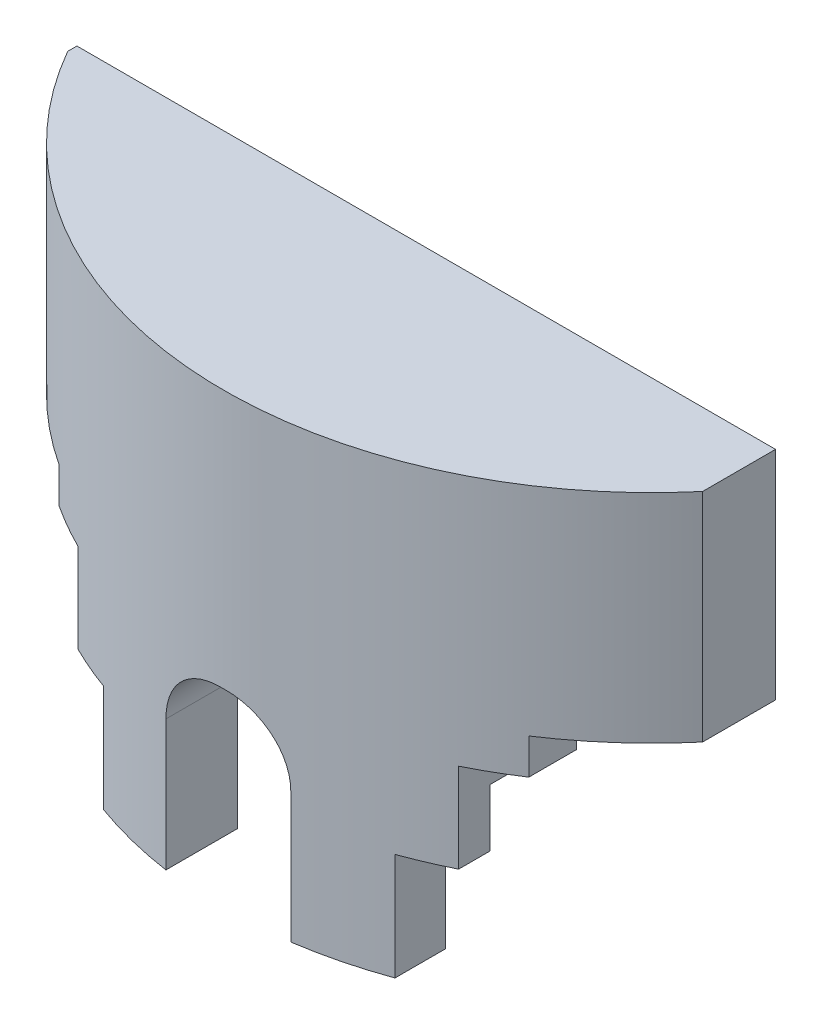
ISO-10303-21;
HEADER;
FILE_DESCRIPTION(('STEP AP214'),'2;1');
FILE_NAME('part.step','',(''),(''),'','','');
FILE_SCHEMA(('AUTOMOTIVE_DESIGN { 1 0 10303 214 1 1 1 1 }'));
ENDSEC;
DATA;
#1=APPLICATION_CONTEXT('core data for automotive mechanical design processes');
#2=APPLICATION_PROTOCOL_DEFINITION('international standard','automotive_design',2000,#1);
#3=PRODUCT_CONTEXT('',#1,'mechanical');
#4=PRODUCT('Part','Part','',(#3));
#5=PRODUCT_RELATED_PRODUCT_CATEGORY('part','',(#4));
#6=PRODUCT_DEFINITION_FORMATION('','',#4);
#7=PRODUCT_DEFINITION_CONTEXT('part definition',#1,'design');
#8=PRODUCT_DEFINITION('design','',#6,#7);
#9=PRODUCT_DEFINITION_SHAPE('','',#8);
#10=(LENGTH_UNIT() NAMED_UNIT(*) SI_UNIT(.MILLI.,.METRE.));
#11=(NAMED_UNIT(*) PLANE_ANGLE_UNIT() SI_UNIT($,.RADIAN.));
#12=(NAMED_UNIT(*) SI_UNIT($,.STERADIAN.) SOLID_ANGLE_UNIT());
#13=UNCERTAINTY_MEASURE_WITH_UNIT(LENGTH_MEASURE(1.E-05),#10,'distance_accuracy_value','');
#14=(GEOMETRIC_REPRESENTATION_CONTEXT(3) GLOBAL_UNCERTAINTY_ASSIGNED_CONTEXT((#13)) GLOBAL_UNIT_ASSIGNED_CONTEXT((#10,
#11,#12)) REPRESENTATION_CONTEXT('',''));
#15=CARTESIAN_POINT('',(0.,0.,0.));
#16=DIRECTION('',(0.,0.,1.));
#17=DIRECTION('',(1.,0.,0.));
#18=AXIS2_PLACEMENT_3D('',#15,#16,#17);
#19=CARTESIAN_POINT('',(0.,-42.5,0.));
#20=DIRECTION('',(0.,-1.,0.));
#21=DIRECTION('',(0.,0.,-1.));
#22=AXIS2_PLACEMENT_3D('',#19,#20,#21);
#23=PLANE('',#22);
#24=DIRECTION('',(0.,0.,1.));
#25=VECTOR('',#24,1.);
#26=CARTESIAN_POINT('',(32.,-42.5,34.2));
#27=LINE('',#26,#25);
#28=CARTESIAN_POINT('',(32.,-42.5,52.2));
#29=VERTEX_POINT('',#28);
#30=CARTESIAN_POINT('',(32.,-42.5,64.4980619863884));
#31=VERTEX_POINT('',#30);
#32=EDGE_CURVE('E381',#29,#31,#27,.T.);
#33=ORIENTED_EDGE('',*,*,#32,.F.);
#34=DIRECTION('',(1.,0.,0.));
#35=VECTOR('',#34,1.);
#36=CARTESIAN_POINT('',(0.,-42.5,52.2));
#37=LINE('',#36,#35);
#38=CARTESIAN_POINT('',(39.5,-42.5,52.2));
#39=VERTEX_POINT('',#38);
#40=EDGE_CURVE('E479',#29,#39,#37,.T.);
#41=ORIENTED_EDGE('',*,*,#40,.T.);
#42=DIRECTION('',(0.,0.,1.));
#43=VECTOR('',#42,1.);
#44=CARTESIAN_POINT('',(39.5,-42.5,0.));
#45=LINE('',#44,#43);
#46=CARTESIAN_POINT('',(39.5,-42.5,60.1975913139388));
#47=VERTEX_POINT('',#46);
#48=EDGE_CURVE('E370',#39,#47,#45,.T.);
#49=ORIENTED_EDGE('',*,*,#48,.T.);
#50=CARTESIAN_POINT('',(0.,-42.5,0.));
#51=DIRECTION('',(0.,-1.,0.));
#52=DIRECTION('',(0.,0.,-1.));
#53=AXIS2_PLACEMENT_3D('',#50,#51,#52);
#54=CIRCLE('',#53,72.);
#55=EDGE_CURVE('E359',#47,#31,#54,.T.);
#56=ORIENTED_EDGE('',*,*,#55,.T.);
#57=EDGE_LOOP('',(#33,#41,#49,#56));
#58=FACE_BOUND('',#57,.T.);
#59=ADVANCED_FACE('F36',(#58),#23,.T.);
#60=CARTESIAN_POINT('',(39.5,-42.5,0.));
#61=DIRECTION('',(-1.,0.,0.));
#62=DIRECTION('',(0.,0.,1.));
#63=AXIS2_PLACEMENT_3D('',#60,#61,#62);
#64=PLANE('',#63);
#65=ORIENTED_EDGE('',*,*,#48,.F.);
#66=DIRECTION('',(0.,-1.,0.));
#67=VECTOR('',#66,1.);
#68=CARTESIAN_POINT('',(39.5,-42.5,52.2));
#69=LINE('',#68,#67);
#70=CARTESIAN_POINT('',(39.5,-36.5,52.2));
#71=VERTEX_POINT('',#70);
#72=EDGE_CURVE('E450',#71,#39,#69,.T.);
#73=ORIENTED_EDGE('',*,*,#72,.F.);
#74=DIRECTION('',(0.,0.,1.));
#75=VECTOR('',#74,1.);
#76=CARTESIAN_POINT('',(39.5,-36.5,0.));
#77=LINE('',#76,#75);
#78=CARTESIAN_POINT('',(39.5,-36.5,60.1975913139388));
#79=VERTEX_POINT('',#78);
#80=EDGE_CURVE('E365',#71,#79,#77,.T.);
#81=ORIENTED_EDGE('',*,*,#80,.T.);
#82=DIRECTION('',(0.,1.,0.));
#83=VECTOR('',#82,1.);
#84=CARTESIAN_POINT('',(39.5,-42.5,60.1975913139388));
#85=LINE('',#84,#83);
#86=EDGE_CURVE('E250',#47,#79,#85,.T.);
#87=ORIENTED_EDGE('',*,*,#86,.F.);
#88=EDGE_LOOP('',(#65,#73,#81,#87));
#89=FACE_BOUND('',#88,.T.);
#90=ADVANCED_FACE('F324',(#89),#64,.F.);
#91=CARTESIAN_POINT('',(-39.5,-42.5,0.));
#92=DIRECTION('',(1.,0.,0.));
#93=DIRECTION('',(0.,0.,-1.));
#94=AXIS2_PLACEMENT_3D('',#91,#92,#93);
#95=PLANE('',#94);
#96=DIRECTION('',(0.,1.,0.));
#97=VECTOR('',#96,1.);
#98=CARTESIAN_POINT('',(-39.5,-42.5,52.2));
#99=LINE('',#98,#97);
#100=CARTESIAN_POINT('',(-39.5,-42.5,52.2));
#101=VERTEX_POINT('',#100);
#102=CARTESIAN_POINT('',(-39.5,-36.5,52.2));
#103=VERTEX_POINT('',#102);
#104=EDGE_CURVE('E454',#101,#103,#99,.T.);
#105=ORIENTED_EDGE('',*,*,#104,.F.);
#106=DIRECTION('',(0.,0.,-1.));
#107=VECTOR('',#106,1.);
#108=CARTESIAN_POINT('',(-39.5,-42.5,0.));
#109=LINE('',#108,#107);
#110=CARTESIAN_POINT('',(-39.5,-42.5,60.1975913139388));
#111=VERTEX_POINT('',#110);
#112=EDGE_CURVE('E350',#111,#101,#109,.T.);
#113=ORIENTED_EDGE('',*,*,#112,.F.);
#114=DIRECTION('',(0.,1.,0.));
#115=VECTOR('',#114,1.);
#116=CARTESIAN_POINT('',(-39.5,-42.5,60.1975913139388));
#117=LINE('',#116,#115);
#118=CARTESIAN_POINT('',(-39.5,-36.5,60.1975913139388));
#119=VERTEX_POINT('',#118);
#120=EDGE_CURVE('E358',#111,#119,#117,.T.);
#121=ORIENTED_EDGE('',*,*,#120,.T.);
#122=DIRECTION('',(0.,0.,-1.));
#123=VECTOR('',#122,1.);
#124=CARTESIAN_POINT('',(-39.5,-36.5,0.));
#125=LINE('',#124,#123);
#126=EDGE_CURVE('E367',#119,#103,#125,.T.);
#127=ORIENTED_EDGE('',*,*,#126,.T.);
#128=EDGE_LOOP('',(#105,#113,#121,#127));
#129=FACE_BOUND('',#128,.T.);
#130=ADVANCED_FACE('F331',(#129),#95,.F.);
#131=ORIENTED_EDGE('',*,*,#112,.T.);
#132=DIRECTION('',(1.,0.,0.));
#133=VECTOR('',#132,1.);
#134=CARTESIAN_POINT('',(0.,-42.5,52.2));
#135=LINE('',#134,#133);
#136=CARTESIAN_POINT('',(-32.,-42.5,52.2));
#137=VERTEX_POINT('',#136);
#138=EDGE_CURVE('E352',#101,#137,#135,.T.);
#139=ORIENTED_EDGE('',*,*,#138,.T.);
#140=DIRECTION('',(0.,0.,-1.));
#141=VECTOR('',#140,1.);
#142=CARTESIAN_POINT('',(-32.,-42.5,64.4980619863884));
#143=LINE('',#142,#141);
#144=CARTESIAN_POINT('',(-32.,-42.5,64.4980619863884));
#145=VERTEX_POINT('',#144);
#146=EDGE_CURVE('E384',#145,#137,#143,.T.);
#147=ORIENTED_EDGE('',*,*,#146,.F.);
#148=EDGE_CURVE('E355',#145,#111,#54,.T.);
#149=ORIENTED_EDGE('',*,*,#148,.T.);
#150=EDGE_LOOP('',(#131,#139,#147,#149));
#151=FACE_BOUND('',#150,.T.);
#152=ADVANCED_FACE('F327',(#151),#23,.T.);
#153=CARTESIAN_POINT('',(-32.,-57.5,64.4980619863884));
#154=DIRECTION('',(1.,0.,0.));
#155=DIRECTION('',(0.,0.,-1.));
#156=AXIS2_PLACEMENT_3D('',#153,#154,#155);
#157=PLANE('',#156);
#158=DIRECTION('',(0.,1.,0.));
#159=VECTOR('',#158,1.);
#160=CARTESIAN_POINT('',(-32.,-57.5,52.2));
#161=LINE('',#160,#159);
#162=CARTESIAN_POINT('',(-32.,-47.8210916541997,52.2));
#163=VERTEX_POINT('',#162);
#164=EDGE_CURVE('E482',#163,#137,#161,.T.);
#165=ORIENTED_EDGE('',*,*,#164,.F.);
#166=DIRECTION('',(0.,0.,-1.));
#167=VECTOR('',#166,1.);
#168=CARTESIAN_POINT('',(-32.,-47.8210916541997,59.2));
#169=LINE('',#168,#167);
#170=CARTESIAN_POINT('',(-32.,-47.8210916541997,59.2));
#171=VERTEX_POINT('',#170);
#172=EDGE_CURVE('E406',#163,#171,#169,.F.);
#173=ORIENTED_EDGE('',*,*,#172,.T.);
#174=DIRECTION('',(0.,1.,0.));
#175=VECTOR('',#174,1.);
#176=CARTESIAN_POINT('',(-32.,-57.5,59.2));
#177=LINE('',#176,#175);
#178=CARTESIAN_POINT('',(-32.,-57.5,59.2));
#179=VERTEX_POINT('',#178);
#180=EDGE_CURVE('E415',#179,#171,#177,.T.);
#181=ORIENTED_EDGE('',*,*,#180,.F.);
#182=DIRECTION('',(0.,0.,-1.));
#183=VECTOR('',#182,1.);
#184=CARTESIAN_POINT('',(-32.,-57.5,64.4980619863884));
#185=LINE('',#184,#183);
#186=CARTESIAN_POINT('',(-32.,-57.5,64.4980619863884));
#187=VERTEX_POINT('',#186);
#188=EDGE_CURVE('E388',#187,#179,#185,.T.);
#189=ORIENTED_EDGE('',*,*,#188,.F.);
#190=DIRECTION('',(0.,1.,0.));
#191=VECTOR('',#190,1.);
#192=CARTESIAN_POINT('',(-32.,-57.5,64.4980619863884));
#193=LINE('',#192,#191);
#194=EDGE_CURVE('E368',#187,#145,#193,.T.);
#195=ORIENTED_EDGE('',*,*,#194,.T.);
#196=ORIENTED_EDGE('',*,*,#146,.T.);
#197=EDGE_LOOP('',(#165,#173,#181,#189,#195,#196));
#198=FACE_BOUND('',#197,.T.);
#199=ADVANCED_FACE('F338',(#198),#157,.F.);
#200=CARTESIAN_POINT('',(32.,-57.5,34.2));
#201=DIRECTION('',(-1.,0.,0.));
#202=DIRECTION('',(0.,0.,1.));
#203=AXIS2_PLACEMENT_3D('',#200,#201,#202);
#204=PLANE('',#203);
#205=DIRECTION('',(0.,-1.,0.));
#206=VECTOR('',#205,1.);
#207=CARTESIAN_POINT('',(32.,-57.5,52.2));
#208=LINE('',#207,#206);
#209=CARTESIAN_POINT('',(32.,-47.8210916541997,52.2));
#210=VERTEX_POINT('',#209);
#211=EDGE_CURVE('E470',#29,#210,#208,.T.);
#212=ORIENTED_EDGE('',*,*,#211,.F.);
#213=ORIENTED_EDGE('',*,*,#32,.T.);
#214=DIRECTION('',(0.,1.,0.));
#215=VECTOR('',#214,1.);
#216=CARTESIAN_POINT('',(32.,-57.5,64.4980619863884));
#217=LINE('',#216,#215);
#218=CARTESIAN_POINT('',(32.,-57.5,64.4980619863884));
#219=VERTEX_POINT('',#218);
#220=EDGE_CURVE('E377',#219,#31,#217,.T.);
#221=ORIENTED_EDGE('',*,*,#220,.F.);
#222=DIRECTION('',(0.,0.,1.));
#223=VECTOR('',#222,1.);
#224=CARTESIAN_POINT('',(32.,-57.5,34.2));
#225=LINE('',#224,#223);
#226=CARTESIAN_POINT('',(32.,-57.5,59.2));
#227=VERTEX_POINT('',#226);
#228=EDGE_CURVE('E380',#227,#219,#225,.T.);
#229=ORIENTED_EDGE('',*,*,#228,.F.);
#230=DIRECTION('',(0.,-1.,0.));
#231=VECTOR('',#230,1.);
#232=CARTESIAN_POINT('',(32.,-57.5,59.2));
#233=LINE('',#232,#231);
#234=CARTESIAN_POINT('',(32.,-47.8210916541997,59.2));
#235=VERTEX_POINT('',#234);
#236=EDGE_CURVE('E421',#235,#227,#233,.T.);
#237=ORIENTED_EDGE('',*,*,#236,.F.);
#238=DIRECTION('',(0.,0.,-1.));
#239=VECTOR('',#238,1.);
#240=CARTESIAN_POINT('',(32.,-47.8210916541997,59.2));
#241=LINE('',#240,#239);
#242=EDGE_CURVE('E270',#235,#210,#241,.T.);
#243=ORIENTED_EDGE('',*,*,#242,.T.);
#244=EDGE_LOOP('',(#212,#213,#221,#229,#237,#243));
#245=FACE_BOUND('',#244,.T.);
#246=ADVANCED_FACE('F344',(#245),#204,.F.);
#247=CARTESIAN_POINT('',(0.,-53.5,59.2));
#248=DIRECTION('',(0.,0.,-1.));
#249=DIRECTION('',(-1.,0.,0.));
#250=AXIS2_PLACEMENT_3D('',#247,#248,#249);
#251=CYLINDRICAL_SURFACE('',#250,32.5);
#252=CARTESIAN_POINT('',(0.,-53.5,52.2));
#253=DIRECTION('',(0.,0.,-1.));
#254=DIRECTION('',(-1.,0.,0.));
#255=AXIS2_PLACEMENT_3D('',#252,#253,#254);
#256=CIRCLE('',#255,32.5);
#257=EDGE_CURVE('E45',#210,#163,#256,.F.);
#258=ORIENTED_EDGE('',*,*,#257,.F.);
#259=ORIENTED_EDGE('',*,*,#242,.F.);
#260=CARTESIAN_POINT('',(0.,-53.5,59.2));
#261=DIRECTION('',(0.,0.,-1.));
#262=DIRECTION('',(-1.,0.,0.));
#263=AXIS2_PLACEMENT_3D('',#260,#261,#262);
#264=CIRCLE('',#263,32.5);
#265=EDGE_CURVE('E430',#171,#235,#264,.T.);
#266=ORIENTED_EDGE('',*,*,#265,.F.);
#267=ORIENTED_EDGE('',*,*,#172,.F.);
#268=EDGE_LOOP('',(#258,#259,#266,#267));
#269=FACE_BOUND('',#268,.T.);
#270=ADVANCED_FACE('F491',(#269),#251,.F.);
#271=CARTESIAN_POINT('',(0.,-75.5,0.));
#272=DIRECTION('',(0.,1.,0.));
#273=DIRECTION('',(0.,0.,1.));
#274=AXIS2_PLACEMENT_3D('',#271,#272,#273);
#275=PLANE('',#274);
#276=DIRECTION('',(-1.,0.,0.));
#277=VECTOR('',#276,1.);
#278=CARTESIAN_POINT('',(0.,-75.5,59.2));
#279=LINE('',#278,#277);
#280=CARTESIAN_POINT('',(-10.5,-75.5,59.2));
#281=VERTEX_POINT('',#280);
#282=CARTESIAN_POINT('',(-24.5,-75.5,59.2));
#283=VERTEX_POINT('',#282);
#284=EDGE_CURVE('E265',#281,#283,#279,.T.);
#285=ORIENTED_EDGE('',*,*,#284,.F.);
#286=DIRECTION('',(0.,0.,-1.));
#287=VECTOR('',#286,1.);
#288=CARTESIAN_POINT('',(-10.5,-75.5,34.2));
#289=LINE('',#288,#287);
#290=CARTESIAN_POINT('',(-10.5,-75.5,71.2302604235026));
#291=VERTEX_POINT('',#290);
#292=EDGE_CURVE('E442',#291,#281,#289,.T.);
#293=ORIENTED_EDGE('',*,*,#292,.F.);
#294=CARTESIAN_POINT('',(0.,-75.5,0.));
#295=DIRECTION('',(0.,-1.,0.));
#296=DIRECTION('',(0.,0.,1.));
#297=AXIS2_PLACEMENT_3D('',#294,#295,#296);
#298=CIRCLE('',#297,72.);
#299=CARTESIAN_POINT('',(-24.5,-75.5,67.7033972559723));
#300=VERTEX_POINT('',#299);
#301=EDGE_CURVE('E412',#291,#300,#298,.T.);
#302=ORIENTED_EDGE('',*,*,#301,.T.);
#303=DIRECTION('',(0.,0.,-1.));
#304=VECTOR('',#303,1.);
#305=CARTESIAN_POINT('',(-24.5,-75.5,34.2));
#306=LINE('',#305,#304);
#307=EDGE_CURVE('E399',#300,#283,#306,.T.);
#308=ORIENTED_EDGE('',*,*,#307,.T.);
#309=EDGE_LOOP('',(#285,#293,#302,#308));
#310=FACE_BOUND('',#309,.T.);
#311=ADVANCED_FACE('F540',(#310),#275,.F.);
#312=CARTESIAN_POINT('',(0.,-57.5,0.));
#313=DIRECTION('',(0.,-1.,0.));
#314=DIRECTION('',(0.,0.,-1.));
#315=AXIS2_PLACEMENT_3D('',#312,#313,#314);
#316=PLANE('',#315);
#317=ORIENTED_EDGE('',*,*,#188,.T.);
#318=DIRECTION('',(1.,0.,0.));
#319=VECTOR('',#318,1.);
#320=CARTESIAN_POINT('',(0.,-57.5,59.2));
#321=LINE('',#320,#319);
#322=CARTESIAN_POINT('',(-24.5,-57.5,59.2));
#323=VERTEX_POINT('',#322);
#324=EDGE_CURVE('E418',#179,#323,#321,.T.);
#325=ORIENTED_EDGE('',*,*,#324,.T.);
#326=DIRECTION('',(0.,0.,-1.));
#327=VECTOR('',#326,1.);
#328=CARTESIAN_POINT('',(-24.5,-57.5,34.2));
#329=LINE('',#328,#327);
#330=CARTESIAN_POINT('',(-24.5,-57.5,67.7033972559723));
#331=VERTEX_POINT('',#330);
#332=EDGE_CURVE('E400',#331,#323,#329,.T.);
#333=ORIENTED_EDGE('',*,*,#332,.F.);
#334=CARTESIAN_POINT('',(0.,-57.5,0.));
#335=DIRECTION('',(0.,-1.,0.));
#336=DIRECTION('',(0.,0.,-1.));
#337=AXIS2_PLACEMENT_3D('',#334,#335,#336);
#338=CIRCLE('',#337,72.);
#339=EDGE_CURVE('E383',#331,#187,#338,.T.);
#340=ORIENTED_EDGE('',*,*,#339,.T.);
#341=EDGE_LOOP('',(#317,#325,#333,#340));
#342=FACE_BOUND('',#341,.T.);
#343=ADVANCED_FACE('F549',(#342),#316,.T.);
#344=DIRECTION('',(0.,0.,1.));
#345=VECTOR('',#344,1.);
#346=CARTESIAN_POINT('',(24.5,-57.5,34.2));
#347=LINE('',#346,#345);
#348=CARTESIAN_POINT('',(24.5,-57.5,59.2));
#349=VERTEX_POINT('',#348);
#350=CARTESIAN_POINT('',(24.5,-57.5,67.7033972559723));
#351=VERTEX_POINT('',#350);
#352=EDGE_CURVE('E404',#349,#351,#347,.T.);
#353=ORIENTED_EDGE('',*,*,#352,.F.);
#354=DIRECTION('',(1.,0.,0.));
#355=VECTOR('',#354,1.);
#356=CARTESIAN_POINT('',(0.,-57.5,59.2));
#357=LINE('',#356,#355);
#358=EDGE_CURVE('E423',#349,#227,#357,.T.);
#359=ORIENTED_EDGE('',*,*,#358,.T.);
#360=ORIENTED_EDGE('',*,*,#228,.T.);
#361=EDGE_CURVE('E391',#219,#351,#338,.T.);
#362=ORIENTED_EDGE('',*,*,#361,.T.);
#363=EDGE_LOOP('',(#353,#359,#360,#362));
#364=FACE_BOUND('',#363,.T.);
#365=ADVANCED_FACE('F503',(#364),#316,.T.);
#366=CARTESIAN_POINT('',(24.5,-75.5,34.2));
#367=DIRECTION('',(-1.,0.,0.));
#368=DIRECTION('',(0.,0.,1.));
#369=AXIS2_PLACEMENT_3D('',#366,#367,#368);
#370=PLANE('',#369);
#371=DIRECTION('',(0.,-1.,0.));
#372=VECTOR('',#371,1.);
#373=CARTESIAN_POINT('',(24.5,-75.5,59.2));
#374=LINE('',#373,#372);
#375=CARTESIAN_POINT('',(24.5,-75.5,59.2));
#376=VERTEX_POINT('',#375);
#377=EDGE_CURVE('E426',#349,#376,#374,.T.);
#378=ORIENTED_EDGE('',*,*,#377,.F.);
#379=ORIENTED_EDGE('',*,*,#352,.T.);
#380=DIRECTION('',(0.,1.,0.));
#381=VECTOR('',#380,1.);
#382=CARTESIAN_POINT('',(24.5,-75.5,67.7033972559723));
#383=LINE('',#382,#381);
#384=CARTESIAN_POINT('',(24.5,-75.5,67.7033972559723));
#385=VERTEX_POINT('',#384);
#386=EDGE_CURVE('E386',#385,#351,#383,.T.);
#387=ORIENTED_EDGE('',*,*,#386,.F.);
#388=DIRECTION('',(0.,0.,1.));
#389=VECTOR('',#388,1.);
#390=CARTESIAN_POINT('',(24.5,-75.5,34.2));
#391=LINE('',#390,#389);
#392=EDGE_CURVE('E403',#376,#385,#391,.T.);
#393=ORIENTED_EDGE('',*,*,#392,.F.);
#394=EDGE_LOOP('',(#378,#379,#387,#393));
#395=FACE_BOUND('',#394,.T.);
#396=ADVANCED_FACE('F508',(#395),#370,.F.);
#397=CARTESIAN_POINT('',(-24.5,-75.5,34.2));
#398=DIRECTION('',(1.,0.,0.));
#399=DIRECTION('',(0.,0.,-1.));
#400=AXIS2_PLACEMENT_3D('',#397,#398,#399);
#401=PLANE('',#400);
#402=DIRECTION('',(0.,1.,0.));
#403=VECTOR('',#402,1.);
#404=CARTESIAN_POINT('',(-24.5,-75.5,59.2));
#405=LINE('',#404,#403);
#406=EDGE_CURVE('E428',#283,#323,#405,.T.);
#407=ORIENTED_EDGE('',*,*,#406,.F.);
#408=ORIENTED_EDGE('',*,*,#307,.F.);
#409=DIRECTION('',(0.,1.,0.));
#410=VECTOR('',#409,1.);
#411=CARTESIAN_POINT('',(-24.5,-75.5,67.7033972559723));
#412=LINE('',#411,#410);
#413=EDGE_CURVE('E396',#300,#331,#412,.T.);
#414=ORIENTED_EDGE('',*,*,#413,.T.);
#415=ORIENTED_EDGE('',*,*,#332,.T.);
#416=EDGE_LOOP('',(#407,#408,#414,#415));
#417=FACE_BOUND('',#416,.T.);
#418=ADVANCED_FACE('F543',(#417),#401,.F.);
#419=CARTESIAN_POINT('',(10.5,-75.5,71.2302604235026));
#420=VERTEX_POINT('',#419);
#421=EDGE_CURVE('E409',#385,#420,#298,.T.);
#422=ORIENTED_EDGE('',*,*,#421,.T.);
#423=DIRECTION('',(0.,0.,1.));
#424=VECTOR('',#423,1.);
#425=CARTESIAN_POINT('',(10.5,-75.5,34.2));
#426=LINE('',#425,#424);
#427=CARTESIAN_POINT('',(10.5,-75.5,59.2));
#428=VERTEX_POINT('',#427);
#429=EDGE_CURVE('E440',#428,#420,#426,.T.);
#430=ORIENTED_EDGE('',*,*,#429,.F.);
#431=EDGE_CURVE('E267',#376,#428,#279,.T.);
#432=ORIENTED_EDGE('',*,*,#431,.F.);
#433=ORIENTED_EDGE('',*,*,#392,.T.);
#434=EDGE_LOOP('',(#422,#430,#432,#433));
#435=FACE_BOUND('',#434,.T.);
#436=ADVANCED_FACE('F512',(#435),#275,.F.);
#437=CARTESIAN_POINT('',(0.,-36.5,0.));
#438=DIRECTION('',(0.,1.,0.));
#439=DIRECTION('',(0.,0.,1.));
#440=AXIS2_PLACEMENT_3D('',#437,#438,#439);
#441=PLANE('',#440);
#442=DIRECTION('',(-1.,0.,0.));
#443=VECTOR('',#442,1.);
#444=CARTESIAN_POINT('',(-62.5,-36.5,34.2));
#445=LINE('',#444,#443);
#446=CARTESIAN_POINT('',(-40.7749773139559,-36.5,34.2));
#447=VERTEX_POINT('',#446);
#448=CARTESIAN_POINT('',(-62.5,-36.5,34.2));
#449=VERTEX_POINT('',#448);
#450=EDGE_CURVE('E243',#447,#449,#445,.T.);
#451=ORIENTED_EDGE('',*,*,#450,.F.);
#452=DIRECTION('',(0.,0.,-1.));
#453=VECTOR('',#452,1.);
#454=CARTESIAN_POINT('',(-40.7749773139559,-36.5,52.2));
#455=LINE('',#454,#453);
#456=CARTESIAN_POINT('',(-40.7749773139559,-36.5,52.2));
#457=VERTEX_POINT('',#456);
#458=EDGE_CURVE('E445',#447,#457,#455,.F.);
#459=ORIENTED_EDGE('',*,*,#458,.T.);
#460=DIRECTION('',(-1.,0.,0.));
#461=VECTOR('',#460,1.);
#462=CARTESIAN_POINT('',(0.,-36.5,52.2));
#463=LINE('',#462,#461);
#464=EDGE_CURVE('E452',#103,#457,#463,.T.);
#465=ORIENTED_EDGE('',*,*,#464,.F.);
#466=ORIENTED_EDGE('',*,*,#126,.F.);
#467=CARTESIAN_POINT('',(0.,-36.5,0.));
#468=DIRECTION('',(0.,1.,0.));
#469=DIRECTION('',(0.,0.,1.));
#470=AXIS2_PLACEMENT_3D('',#467,#468,#469);
#471=CIRCLE('',#470,72.);
#472=CARTESIAN_POINT('',(-62.5,-36.5,35.7456291034303));
#473=VERTEX_POINT('',#472);
#474=EDGE_CURVE('E253',#473,#119,#471,.T.);
#475=ORIENTED_EDGE('',*,*,#474,.F.);
#476=DIRECTION('',(0.,0.,1.));
#477=VECTOR('',#476,1.);
#478=CARTESIAN_POINT('',(-62.5,-36.5,34.2));
#479=LINE('',#478,#477);
#480=EDGE_CURVE('E242',#449,#473,#479,.T.);
#481=ORIENTED_EDGE('',*,*,#480,.F.);
#482=EDGE_LOOP('',(#451,#459,#465,#466,#475,#481));
#483=FACE_BOUND('',#482,.T.);
#484=ADVANCED_FACE('F322',(#483),#441,.F.);
#485=CARTESIAN_POINT('',(55.,-36.5,34.2));
#486=VERTEX_POINT('',#485);
#487=CARTESIAN_POINT('',(40.7749773139559,-36.5,34.2));
#488=VERTEX_POINT('',#487);
#489=EDGE_CURVE('E233',#486,#488,#445,.T.);
#490=ORIENTED_EDGE('',*,*,#489,.F.);
#491=DIRECTION('',(0.,0.,-1.));
#492=VECTOR('',#491,1.);
#493=CARTESIAN_POINT('',(55.,-36.5,72.));
#494=LINE('',#493,#492);
#495=CARTESIAN_POINT('',(55.,-36.5,46.4650406219558));
#496=VERTEX_POINT('',#495);
#497=EDGE_CURVE('E220',#496,#486,#494,.T.);
#498=ORIENTED_EDGE('',*,*,#497,.F.);
#499=EDGE_CURVE('E246',#79,#496,#471,.T.);
#500=ORIENTED_EDGE('',*,*,#499,.F.);
#501=ORIENTED_EDGE('',*,*,#80,.F.);
#502=DIRECTION('',(-1.,0.,0.));
#503=VECTOR('',#502,1.);
#504=CARTESIAN_POINT('',(0.,-36.5,52.2));
#505=LINE('',#504,#503);
#506=CARTESIAN_POINT('',(40.7749773139559,-36.5,52.2));
#507=VERTEX_POINT('',#506);
#508=EDGE_CURVE('E448',#507,#71,#505,.T.);
#509=ORIENTED_EDGE('',*,*,#508,.F.);
#510=DIRECTION('',(0.,0.,-1.));
#511=VECTOR('',#510,1.);
#512=CARTESIAN_POINT('',(40.7749773139559,-36.5,52.2));
#513=LINE('',#512,#511);
#514=EDGE_CURVE('E241',#507,#488,#513,.T.);
#515=ORIENTED_EDGE('',*,*,#514,.T.);
#516=EDGE_LOOP('',(#490,#498,#500,#501,#509,#515));
#517=FACE_BOUND('',#516,.T.);
#518=ADVANCED_FACE('F239',(#517),#441,.F.);
#519=CARTESIAN_POINT('',(-62.5,-36.5,34.2));
#520=DIRECTION('',(0.,0.,-1.));
#521=DIRECTION('',(-1.,0.,0.));
#522=AXIS2_PLACEMENT_3D('',#519,#520,#521);
#523=PLANE('',#522);
#524=DIRECTION('',(0.,1.,0.));
#525=VECTOR('',#524,1.);
#526=CARTESIAN_POINT('',(55.,0.,34.2));
#527=LINE('',#526,#525);
#528=CARTESIAN_POINT('',(55.,0.,34.2));
#529=VERTEX_POINT('',#528);
#530=EDGE_CURVE('E51',#486,#529,#527,.T.);
#531=ORIENTED_EDGE('',*,*,#530,.F.);
#532=ORIENTED_EDGE('',*,*,#489,.T.);
#533=CARTESIAN_POINT('',(27.,-22.,34.2));
#534=DIRECTION('',(0.,0.,-1.));
#535=DIRECTION('',(-1.,0.,0.));
#536=AXIS2_PLACEMENT_3D('',#533,#534,#535);
#537=CIRCLE('',#536,20.);
#538=CARTESIAN_POINT('',(27.,-2.,34.2));
#539=VERTEX_POINT('',#538);
#540=EDGE_CURVE('E468',#539,#488,#537,.T.);
#541=ORIENTED_EDGE('',*,*,#540,.F.);
#542=DIRECTION('',(1.,0.,0.));
#543=VECTOR('',#542,1.);
#544=CARTESIAN_POINT('',(27.,-2.,34.2));
#545=LINE('',#544,#543);
#546=CARTESIAN_POINT('',(-27.,-2.,34.2));
#547=VERTEX_POINT('',#546);
#548=EDGE_CURVE('E462',#547,#539,#545,.T.);
#549=ORIENTED_EDGE('',*,*,#548,.F.);
#550=CARTESIAN_POINT('',(-27.,-22.,34.2));
#551=DIRECTION('',(0.,0.,-1.));
#552=DIRECTION('',(-1.,0.,0.));
#553=AXIS2_PLACEMENT_3D('',#550,#551,#552);
#554=CIRCLE('',#553,20.);
#555=EDGE_CURVE('E466',#447,#547,#554,.T.);
#556=ORIENTED_EDGE('',*,*,#555,.F.);
#557=ORIENTED_EDGE('',*,*,#450,.T.);
#558=DIRECTION('',(0.,1.,0.));
#559=VECTOR('',#558,1.);
#560=CARTESIAN_POINT('',(-62.5,-36.5,34.2));
#561=LINE('',#560,#559);
#562=CARTESIAN_POINT('',(-62.5,0.,34.2));
#563=VERTEX_POINT('',#562);
#564=EDGE_CURVE('E256',#449,#563,#561,.T.);
#565=ORIENTED_EDGE('',*,*,#564,.T.);
#566=DIRECTION('',(-1.,0.,0.));
#567=VECTOR('',#566,1.);
#568=CARTESIAN_POINT('',(-62.5,0.,34.2));
#569=LINE('',#568,#567);
#570=EDGE_CURVE('E236',#529,#563,#569,.T.);
#571=ORIENTED_EDGE('',*,*,#570,.F.);
#572=EDGE_LOOP('',(#531,#532,#541,#549,#556,#557,#565,#571));
#573=FACE_BOUND('',#572,.T.);
#574=ADVANCED_FACE('F231',(#573),#523,.T.);
#575=CARTESIAN_POINT('',(0.,-36.5,0.));
#576=DIRECTION('',(0.,1.,0.));
#577=DIRECTION('',(0.,0.,1.));
#578=AXIS2_PLACEMENT_3D('',#575,#576,#577);
#579=CYLINDRICAL_SURFACE('',#578,72.);
#580=DIRECTION('',(0.,1.,0.));
#581=VECTOR('',#580,1.);
#582=CARTESIAN_POINT('',(55.,-36.5,46.4650406219558));
#583=LINE('',#582,#581);
#584=CARTESIAN_POINT('',(55.,0.,46.4650406219558));
#585=VERTEX_POINT('',#584);
#586=EDGE_CURVE('E223',#585,#496,#583,.F.);
#587=ORIENTED_EDGE('',*,*,#586,.F.);
#588=CARTESIAN_POINT('',(0.,0.,0.));
#589=DIRECTION('',(0.,1.,0.));
#590=DIRECTION('',(0.,0.,1.));
#591=AXIS2_PLACEMENT_3D('',#588,#589,#590);
#592=CIRCLE('',#591,72.);
#593=CARTESIAN_POINT('',(-62.5,0.,35.7456291034303));
#594=VERTEX_POINT('',#593);
#595=EDGE_CURVE('E248',#594,#585,#592,.T.);
#596=ORIENTED_EDGE('',*,*,#595,.F.);
#597=DIRECTION('',(0.,1.,0.));
#598=VECTOR('',#597,1.);
#599=CARTESIAN_POINT('',(-62.5,-36.5,35.7456291034303));
#600=LINE('',#599,#598);
#601=EDGE_CURVE('E263',#473,#594,#600,.T.);
#602=ORIENTED_EDGE('',*,*,#601,.F.);
#603=ORIENTED_EDGE('',*,*,#474,.T.);
#604=ORIENTED_EDGE('',*,*,#120,.F.);
#605=ORIENTED_EDGE('',*,*,#148,.F.);
#606=ORIENTED_EDGE('',*,*,#194,.F.);
#607=ORIENTED_EDGE('',*,*,#339,.F.);
#608=ORIENTED_EDGE('',*,*,#413,.F.);
#609=ORIENTED_EDGE('',*,*,#301,.F.);
#610=DIRECTION('',(0.,1.,0.));
#611=VECTOR('',#610,1.);
#612=CARTESIAN_POINT('',(-10.5,-36.5,71.2302604235026));
#613=LINE('',#612,#611);
#614=CARTESIAN_POINT('',(-10.5,-53.5,71.2302604235026));
#615=VERTEX_POINT('',#614);
#616=EDGE_CURVE('E433',#615,#291,#613,.F.);
#617=ORIENTED_EDGE('',*,*,#616,.F.);
#618=CARTESIAN_POINT('',(-10.5,-53.5,71.2302604235026));
#619=CARTESIAN_POINT('',(-10.5000318896068,-53.2203562502942,71.2302432221756));
#620=CARTESIAN_POINT('',(-10.4882712756268,-52.9407190356558,71.2319889612127));
#621=CARTESIAN_POINT('',(-10.4413968735752,-52.3834744441433,71.2388817151814));
#622=CARTESIAN_POINT('',(-10.4062851157693,-52.1058668929214,71.2440284344145));
#623=CARTESIAN_POINT('',(-10.3129957328335,-51.5549771039073,71.2575905087987));
#624=CARTESIAN_POINT('',(-10.2548456097689,-51.2816901114853,71.2660019664235));
#625=CARTESIAN_POINT('',(-10.1159263531867,-50.7410422084241,71.2858540357494));
#626=CARTESIAN_POINT('',(-10.035157308626,-50.4736812744832,71.2972946355373));
#627=CARTESIAN_POINT('',(-9.85157117391986,-49.9466920465393,71.322893382333));
#628=CARTESIAN_POINT('',(-9.74874799461759,-49.6870659107104,71.3370522797507));
#629=CARTESIAN_POINT('',(-9.52181553738207,-49.1774249950024,71.3676966993025));
#630=CARTESIAN_POINT('',(-9.39770564526705,-48.9274104927009,71.3841822885659));
#631=CARTESIAN_POINT('',(-9.1290984342827,-48.4387357219678,71.4190303174495));
#632=CARTESIAN_POINT('',(-8.98460191016969,-48.2000750114026,71.4373926838974));
#633=CARTESIAN_POINT('',(-8.6762393650125,-47.7357319315694,71.4754992658996));
#634=CARTESIAN_POINT('',(-8.51237333344282,-47.5100495693539,71.4952434822047));
#635=CARTESIAN_POINT('',(-8.16527171992235,-47.0717601864053,71.5357187485123));
#636=CARTESIAN_POINT('',(-7.98191562533108,-46.8592491179221,71.5564554436065));
#637=CARTESIAN_POINT('',(-7.59801232523807,-46.4504002307535,71.5982365684368));
#638=CARTESIAN_POINT('',(-7.39746504846413,-46.2540624791271,71.6192809994484));
#639=CARTESIAN_POINT('',(-6.98052578952238,-45.8788812842905,71.6611202407874));
#640=CARTESIAN_POINT('',(-6.76413061363192,-45.7000413843637,71.6819149998117));
#641=CARTESIAN_POINT('',(-6.31702918332705,-45.3611513214773,71.7226987975393));
#642=CARTESIAN_POINT('',(-6.08632311907676,-45.2011009089234,71.742687846943));
#643=CARTESIAN_POINT('',(-5.61094837467386,-44.9001303575886,71.7814350070208));
#644=CARTESIAN_POINT('',(-5.36621293796585,-44.7593147246447,71.8001861278204));
#645=CARTESIAN_POINT('',(-4.86561400473583,-44.4988316151596,71.8358459721319));
#646=CARTESIAN_POINT('',(-4.60975070369934,-44.3791637672976,71.8527547279906));
#647=CARTESIAN_POINT('',(-4.08881830781539,-44.1619078993171,71.8842791123103));
#648=CARTESIAN_POINT('',(-3.82375393657339,-44.0643087375295,71.8988958967556));
#649=CARTESIAN_POINT('',(-3.28630588925391,-43.8918689333685,71.9254659104105));
#650=CARTESIAN_POINT('',(-3.01392400046756,-43.8170227876363,71.9374197835213));
#651=CARTESIAN_POINT('',(-2.37192200978974,-43.669568979104,71.9618536471884));
#652=CARTESIAN_POINT('',(-2.00011779527075,-43.6060014291924,71.9731839835814));
#653=CARTESIAN_POINT('',(-1.43918488788613,-43.5424209501828,71.9858586131107));
#654=CARTESIAN_POINT('',(-1.25175569149256,-43.526522617226,71.9893627292551));
#655=CARTESIAN_POINT('',(-0.87623592165015,-43.5053118458653,71.9949129806392));
#656=CARTESIAN_POINT('',(-0.688145210481235,-43.5000017607252,71.9969587917021));
#657=CARTESIAN_POINT('',(-0.500000000000001,-43.5,71.9982638679572));
#658=B_SPLINE_CURVE_WITH_KNOTS('',3,(#618,#619,#620,#621,#622,#623,#624,#625,#626,#627,#628,
#629,#630,#631,#632,#633,#634,#635,#636,#637,#638,#639,#640,#641,#642,#643,#644,#645,#646,#647,
#648,#649,#650,#651,#652,#653,#654,#655,#656,#657),.UNSPECIFIED.,.F.,.F.,(4,2,2,2,2,2,2,2,2,2,2,
2,2,2,2,2,2,2,2,4),(0.,0.838668984149888,1.67726505973973,2.51486306250061,3.352457771161,
4.19028403848825,5.02813448353722,5.86595227468688,6.70377052111404,7.54710919596734,
8.39045136735239,9.23396396208348,10.0774653505585,10.9253813594243,11.7732824787841,
12.6207545634395,13.4680215033949,14.5973483535101,15.1614974988911,15.7257720138311),.UNSPECIFIED.);
#659=CARTESIAN_POINT('',(-0.5,-43.5,71.9982638679572));
#660=VERTEX_POINT('',#659);
#661=EDGE_CURVE('E292',#615,#660,#658,.T.);
#662=ORIENTED_EDGE('',*,*,#661,.T.);
#663=CARTESIAN_POINT('',(0.,-43.5,0.));
#664=DIRECTION('',(0.,1.,0.));
#665=DIRECTION('',(0.,0.,1.));
#666=AXIS2_PLACEMENT_3D('',#663,#664,#665);
#667=CIRCLE('',#666,72.);
#668=CARTESIAN_POINT('',(0.5,-43.5,71.9982638679572));
#669=VERTEX_POINT('',#668);
#670=EDGE_CURVE('E437',#669,#660,#667,.F.);
#671=ORIENTED_EDGE('',*,*,#670,.F.);
#672=CARTESIAN_POINT('',(0.5,-43.5,71.9982638679572));
#673=CARTESIAN_POINT('',(0.78000762336906,-43.4999683184682,71.9963356849737));
#674=CARTESIAN_POINT('',(1.05999686224921,-43.5117592701079,71.9927419325381));
#675=CARTESIAN_POINT('',(1.6179208917887,-43.5587502185692,71.9823557636049));
#676=CARTESIAN_POINT('',(1.89585585855376,-43.5939481846911,71.9755636246015));
#677=CARTESIAN_POINT('',(2.44738274096362,-43.6874627262184,71.9589224382079));
#678=CARTESIAN_POINT('',(2.72097932219829,-43.7457524263869,71.9490769473335));
#679=CARTESIAN_POINT('',(3.26222035854874,-43.8850007905836,71.9265683912101));
#680=CARTESIAN_POINT('',(3.52986483529543,-43.9659593722147,71.9139053362026));
#681=CARTESIAN_POINT('',(4.05739469162397,-44.1499729533355,71.8860720382307));
#682=CARTESIAN_POINT('',(4.31727789362795,-44.2530340889937,71.8709010992897));
#683=CARTESIAN_POINT('',(4.82740413965042,-44.4804896614158,71.8384402481452));
#684=CARTESIAN_POINT('',(5.07764691072875,-44.6048847016428,71.8211502760054));
#685=CARTESIAN_POINT('',(5.56674544073701,-44.8741080164946,71.7848973385267));
#686=CARTESIAN_POINT('',(5.80560169923566,-45.0189353935706,71.7659344466892));
#687=CARTESIAN_POINT('',(6.27030023510635,-45.3280049373824,71.7268270169915));
#688=CARTESIAN_POINT('',(6.49614250902219,-45.4922471092743,71.7066824788175));
#689=CARTESIAN_POINT('',(6.93463494366949,-45.8400863464751,71.6656098897417));
#690=CARTESIAN_POINT('',(7.14719402240184,-46.0237977581085,71.6446777351158));
#691=CARTESIAN_POINT('',(7.55610271665037,-46.4084413129949,71.6027064120668));
#692=CARTESIAN_POINT('',(7.75245228095064,-46.6093735106548,71.5816672433057));
#693=CARTESIAN_POINT('',(8.12761493014117,-47.0271089959514,71.5400413319408));
#694=CARTESIAN_POINT('',(8.30642450899062,-47.243915441603,71.5194546804254));
#695=CARTESIAN_POINT('',(8.64520616785713,-47.6918614690535,71.4792943259795));
#696=CARTESIAN_POINT('',(8.80517851699022,-47.9230008460145,71.4597206085801));
#697=CARTESIAN_POINT('',(9.1057672006953,-48.3989882799762,71.4220417824793));
#698=CARTESIAN_POINT('',(9.24630168602142,-48.6438885430235,71.4039430083792));
#699=CARTESIAN_POINT('',(9.50621222082561,-49.1448004760687,71.3698053566074));
#700=CARTESIAN_POINT('',(9.62558866998482,-49.4008119360592,71.3537664400261));
#701=CARTESIAN_POINT('',(9.84224921381293,-49.9220164531871,71.3242041374778));
#702=CARTESIAN_POINT('',(9.93954469777625,-50.187204695244,71.3106794553306));
#703=CARTESIAN_POINT('',(10.1113660517012,-50.7248728682245,71.2865188977067));
#704=CARTESIAN_POINT('',(10.1858974960227,-50.9973509962291,71.2758823150755));
#705=CARTESIAN_POINT('',(10.332178056786,-51.6376611992078,71.254848016763));
#706=CARTESIAN_POINT('',(10.3950941440143,-52.0076126255968,71.245659295417));
#707=CARTESIAN_POINT('',(10.4580195650263,-52.5656928251377,71.2364387073505));
#708=CARTESIAN_POINT('',(10.4737532361598,-52.7521585663945,71.2341256102321));
#709=CARTESIAN_POINT('',(10.4947437843691,-53.1257332703134,71.2310355088365));
#710=CARTESIAN_POINT('',(10.4999983235139,-53.312842367185,71.2302588473437));
#711=CARTESIAN_POINT('',(10.5,-53.5,71.2302604235026));
#712=B_SPLINE_CURVE_WITH_KNOTS('',3,(#672,#673,#674,#675,#676,#677,#678,#679,#680,#681,#682,
#683,#684,#685,#686,#687,#688,#689,#690,#691,#692,#693,#694,#695,#696,#697,#698,#699,#700,#701,
#702,#703,#704,#705,#706,#707,#708,#709,#710,#711),.UNSPECIFIED.,.F.,.F.,(4,2,2,2,2,2,2,2,2,2,2,
2,2,2,2,2,2,2,2,4),(0.,0.839779783765297,1.67948672106807,2.5182192259704,3.35694868228274,
4.19591129098258,5.03489763498569,5.8738471355907,6.71279685899903,7.55698002818426,
8.40116586456617,9.24552010156873,10.0898622743322,10.9376580972085,11.7854379032802,
12.6327794282172,13.47991329315,14.6032966562513,15.1644722705039,15.7257730709991),.UNSPECIFIED.);
#713=CARTESIAN_POINT('',(10.5,-53.5,71.2302604235026));
#714=VERTEX_POINT('',#713);
#715=EDGE_CURVE('E298',#669,#714,#712,.T.);
#716=ORIENTED_EDGE('',*,*,#715,.T.);
#717=DIRECTION('',(0.,1.,0.));
#718=VECTOR('',#717,1.);
#719=CARTESIAN_POINT('',(10.5,-36.5,71.2302604235026));
#720=LINE('',#719,#718);
#721=EDGE_CURVE('E435',#420,#714,#720,.T.);
#722=ORIENTED_EDGE('',*,*,#721,.F.);
#723=ORIENTED_EDGE('',*,*,#421,.F.);
#724=ORIENTED_EDGE('',*,*,#386,.T.);
#725=ORIENTED_EDGE('',*,*,#361,.F.);
#726=ORIENTED_EDGE('',*,*,#220,.T.);
#727=ORIENTED_EDGE('',*,*,#55,.F.);
#728=ORIENTED_EDGE('',*,*,#86,.T.);
#729=ORIENTED_EDGE('',*,*,#499,.T.);
#730=EDGE_LOOP('',(#587,#596,#602,#603,#604,#605,#606,#607,#608,#609,#617,#662,#671,#716,#722,
#723,#724,#725,#726,#727,#728,#729));
#731=FACE_BOUND('',#730,.T.);
#732=ADVANCED_FACE('F306',(#731),#579,.T.);
#733=CARTESIAN_POINT('',(-62.5,-36.5,34.2));
#734=DIRECTION('',(-1.,0.,0.));
#735=DIRECTION('',(0.,0.,1.));
#736=AXIS2_PLACEMENT_3D('',#733,#734,#735);
#737=PLANE('',#736);
#738=DIRECTION('',(0.,0.,1.));
#739=VECTOR('',#738,1.);
#740=CARTESIAN_POINT('',(-62.5,0.,34.2));
#741=LINE('',#740,#739);
#742=EDGE_CURVE('E258',#563,#594,#741,.T.);
#743=ORIENTED_EDGE('',*,*,#742,.F.);
#744=ORIENTED_EDGE('',*,*,#564,.F.);
#745=ORIENTED_EDGE('',*,*,#480,.T.);
#746=ORIENTED_EDGE('',*,*,#601,.T.);
#747=EDGE_LOOP('',(#743,#744,#745,#746));
#748=FACE_BOUND('',#747,.T.);
#749=ADVANCED_FACE('F311',(#748),#737,.T.);
#750=CARTESIAN_POINT('',(0.,0.,0.));
#751=DIRECTION('',(0.,1.,0.));
#752=DIRECTION('',(0.,0.,1.));
#753=AXIS2_PLACEMENT_3D('',#750,#751,#752);
#754=PLANE('',#753);
#755=DIRECTION('',(0.,0.,1.));
#756=VECTOR('',#755,1.);
#757=CARTESIAN_POINT('',(55.,0.,0.));
#758=LINE('',#757,#756);
#759=EDGE_CURVE('E12',#529,#585,#758,.T.);
#760=ORIENTED_EDGE('',*,*,#759,.F.);
#761=ORIENTED_EDGE('',*,*,#570,.T.);
#762=ORIENTED_EDGE('',*,*,#742,.T.);
#763=ORIENTED_EDGE('',*,*,#595,.T.);
#764=EDGE_LOOP('',(#760,#761,#762,#763));
#765=FACE_BOUND('',#764,.T.);
#766=ADVANCED_FACE('F313',(#765),#754,.T.);
#767=CARTESIAN_POINT('',(0.,-53.5,59.2));
#768=DIRECTION('',(0.,0.,-1.));
#769=DIRECTION('',(-1.,0.,0.));
#770=AXIS2_PLACEMENT_3D('',#767,#768,#769);
#771=PLANE('',#770);
#772=DIRECTION('',(0.,1.,0.));
#773=VECTOR('',#772,1.);
#774=CARTESIAN_POINT('',(-10.5,-53.5,59.2));
#775=LINE('',#774,#773);
#776=CARTESIAN_POINT('',(-10.5,-53.5,59.2));
#777=VERTEX_POINT('',#776);
#778=EDGE_CURVE('E278',#281,#777,#775,.T.);
#779=ORIENTED_EDGE('',*,*,#778,.F.);
#780=ORIENTED_EDGE('',*,*,#284,.T.);
#781=ORIENTED_EDGE('',*,*,#406,.T.);
#782=ORIENTED_EDGE('',*,*,#324,.F.);
#783=ORIENTED_EDGE('',*,*,#180,.T.);
#784=ORIENTED_EDGE('',*,*,#265,.T.);
#785=ORIENTED_EDGE('',*,*,#236,.T.);
#786=ORIENTED_EDGE('',*,*,#358,.F.);
#787=ORIENTED_EDGE('',*,*,#377,.T.);
#788=ORIENTED_EDGE('',*,*,#431,.T.);
#789=DIRECTION('',(0.,-1.,0.));
#790=VECTOR('',#789,1.);
#791=CARTESIAN_POINT('',(10.5,-53.5,59.2));
#792=LINE('',#791,#790);
#793=CARTESIAN_POINT('',(10.5,-53.5,59.2));
#794=VERTEX_POINT('',#793);
#795=EDGE_CURVE('E276',#794,#428,#792,.T.);
#796=ORIENTED_EDGE('',*,*,#795,.F.);
#797=CARTESIAN_POINT('',(0.500000000000005,-53.5,59.2));
#798=DIRECTION('',(0.,0.,-1.));
#799=DIRECTION('',(-1.,0.,0.));
#800=AXIS2_PLACEMENT_3D('',#797,#798,#799);
#801=CIRCLE('',#800,10.);
#802=CARTESIAN_POINT('',(0.500000000000005,-43.5,59.2));
#803=VERTEX_POINT('',#802);
#804=EDGE_CURVE('E516',#794,#803,#801,.F.);
#805=ORIENTED_EDGE('',*,*,#804,.T.);
#806=DIRECTION('',(1.,0.,0.));
#807=VECTOR('',#806,1.);
#808=CARTESIAN_POINT('',(0.,-43.5,59.2));
#809=LINE('',#808,#807);
#810=CARTESIAN_POINT('',(-0.5,-43.5,59.2));
#811=VERTEX_POINT('',#810);
#812=EDGE_CURVE('E273',#811,#803,#809,.T.);
#813=ORIENTED_EDGE('',*,*,#812,.F.);
#814=CARTESIAN_POINT('',(-0.5,-53.5,59.2));
#815=DIRECTION('',(0.,0.,-1.));
#816=DIRECTION('',(-1.,0.,0.));
#817=AXIS2_PLACEMENT_3D('',#814,#815,#816);
#818=CIRCLE('',#817,10.);
#819=EDGE_CURVE('E290',#811,#777,#818,.F.);
#820=ORIENTED_EDGE('',*,*,#819,.T.);
#821=EDGE_LOOP('',(#779,#780,#781,#782,#783,#784,#785,#786,#787,#788,#796,#805,#813,#820));
#822=FACE_BOUND('',#821,.T.);
#823=ADVANCED_FACE('F495',(#822),#771,.T.);
#824=CARTESIAN_POINT('',(-10.5,-43.5,34.2));
#825=DIRECTION('',(-1.,0.,0.));
#826=DIRECTION('',(0.,0.,1.));
#827=AXIS2_PLACEMENT_3D('',#824,#825,#826);
#828=PLANE('',#827);
#829=ORIENTED_EDGE('',*,*,#778,.T.);
#830=DIRECTION('',(0.,0.,-1.));
#831=VECTOR('',#830,1.);
#832=CARTESIAN_POINT('',(-10.5,-53.5,71.2302604235026));
#833=LINE('',#832,#831);
#834=EDGE_CURVE('E287',#777,#615,#833,.F.);
#835=ORIENTED_EDGE('',*,*,#834,.T.);
#836=ORIENTED_EDGE('',*,*,#616,.T.);
#837=ORIENTED_EDGE('',*,*,#292,.T.);
#838=EDGE_LOOP('',(#829,#835,#836,#837));
#839=FACE_BOUND('',#838,.T.);
#840=ADVANCED_FACE('F524',(#839),#828,.F.);
#841=CARTESIAN_POINT('',(10.5,-43.5,34.2));
#842=DIRECTION('',(1.,0.,0.));
#843=DIRECTION('',(0.,0.,-1.));
#844=AXIS2_PLACEMENT_3D('',#841,#842,#843);
#845=PLANE('',#844);
#846=ORIENTED_EDGE('',*,*,#721,.T.);
#847=DIRECTION('',(0.,0.,1.));
#848=VECTOR('',#847,1.);
#849=CARTESIAN_POINT('',(10.5,-53.5,59.2));
#850=LINE('',#849,#848);
#851=EDGE_CURVE('E59',#714,#794,#850,.F.);
#852=ORIENTED_EDGE('',*,*,#851,.T.);
#853=ORIENTED_EDGE('',*,*,#795,.T.);
#854=ORIENTED_EDGE('',*,*,#429,.T.);
#855=EDGE_LOOP('',(#846,#852,#853,#854));
#856=FACE_BOUND('',#855,.T.);
#857=ADVANCED_FACE('F521',(#856),#845,.F.);
#858=CARTESIAN_POINT('',(0.,-43.5,0.));
#859=DIRECTION('',(0.,1.,0.));
#860=DIRECTION('',(0.,0.,1.));
#861=AXIS2_PLACEMENT_3D('',#858,#859,#860);
#862=PLANE('',#861);
#863=ORIENTED_EDGE('',*,*,#670,.T.);
#864=DIRECTION('',(0.,0.,-1.));
#865=VECTOR('',#864,1.);
#866=CARTESIAN_POINT('',(-0.5,-43.5,59.2));
#867=LINE('',#866,#865);
#868=EDGE_CURVE('E284',#660,#811,#867,.T.);
#869=ORIENTED_EDGE('',*,*,#868,.T.);
#870=ORIENTED_EDGE('',*,*,#812,.T.);
#871=DIRECTION('',(0.,0.,1.));
#872=VECTOR('',#871,1.);
#873=CARTESIAN_POINT('',(0.500000000000001,-43.5,71.2302604235026));
#874=LINE('',#873,#872);
#875=EDGE_CURVE('E281',#803,#669,#874,.T.);
#876=ORIENTED_EDGE('',*,*,#875,.T.);
#877=EDGE_LOOP('',(#863,#869,#870,#876));
#878=FACE_BOUND('',#877,.T.);
#879=ADVANCED_FACE('F523',(#878),#862,.F.);
#880=CARTESIAN_POINT('',(-0.5,-53.5,0.));
#881=DIRECTION('',(0.,0.,1.));
#882=DIRECTION('',(1.,0.,0.));
#883=AXIS2_PLACEMENT_3D('',#880,#881,#882);
#884=CYLINDRICAL_SURFACE('',#883,10.);
#885=ORIENTED_EDGE('',*,*,#661,.F.);
#886=ORIENTED_EDGE('',*,*,#834,.F.);
#887=ORIENTED_EDGE('',*,*,#819,.F.);
#888=ORIENTED_EDGE('',*,*,#868,.F.);
#889=EDGE_LOOP('',(#885,#886,#887,#888));
#890=FACE_BOUND('',#889,.T.);
#891=ADVANCED_FACE('F303',(#890),#884,.F.);
#892=CARTESIAN_POINT('',(0.500000000000027,-53.5,0.));
#893=DIRECTION('',(0.,0.,-1.));
#894=DIRECTION('',(-1.,0.,0.));
#895=AXIS2_PLACEMENT_3D('',#892,#893,#894);
#896=CYLINDRICAL_SURFACE('',#895,10.);
#897=ORIENTED_EDGE('',*,*,#804,.F.);
#898=ORIENTED_EDGE('',*,*,#851,.F.);
#899=ORIENTED_EDGE('',*,*,#715,.F.);
#900=ORIENTED_EDGE('',*,*,#875,.F.);
#901=EDGE_LOOP('',(#897,#898,#899,#900));
#902=FACE_BOUND('',#901,.T.);
#903=ADVANCED_FACE('F38',(#902),#896,.F.);
#904=CARTESIAN_POINT('',(27.,-22.,52.2));
#905=DIRECTION('',(0.,0.,-1.));
#906=DIRECTION('',(-1.,0.,0.));
#907=AXIS2_PLACEMENT_3D('',#904,#905,#906);
#908=CYLINDRICAL_SURFACE('',#907,20.);
#909=CARTESIAN_POINT('',(27.,-22.,52.2));
#910=DIRECTION('',(0.,0.,-1.));
#911=DIRECTION('',(-1.,0.,0.));
#912=AXIS2_PLACEMENT_3D('',#909,#910,#911);
#913=CIRCLE('',#912,20.);
#914=CARTESIAN_POINT('',(27.,-2.,52.2));
#915=VERTEX_POINT('',#914);
#916=EDGE_CURVE('E465',#915,#507,#913,.T.);
#917=ORIENTED_EDGE('',*,*,#916,.F.);
#918=DIRECTION('',(0.,0.,-1.));
#919=VECTOR('',#918,1.);
#920=CARTESIAN_POINT('',(27.,-2.,52.2));
#921=LINE('',#920,#919);
#922=EDGE_CURVE('E456',#915,#539,#921,.T.);
#923=ORIENTED_EDGE('',*,*,#922,.T.);
#924=ORIENTED_EDGE('',*,*,#540,.T.);
#925=ORIENTED_EDGE('',*,*,#514,.F.);
#926=EDGE_LOOP('',(#917,#923,#924,#925));
#927=FACE_BOUND('',#926,.T.);
#928=ADVANCED_FACE('F655',(#927),#908,.F.);
#929=CARTESIAN_POINT('',(-27.,-22.,52.2));
#930=DIRECTION('',(0.,0.,-1.));
#931=DIRECTION('',(-1.,0.,0.));
#932=AXIS2_PLACEMENT_3D('',#929,#930,#931);
#933=CYLINDRICAL_SURFACE('',#932,20.);
#934=ORIENTED_EDGE('',*,*,#555,.T.);
#935=DIRECTION('',(0.,0.,-1.));
#936=VECTOR('',#935,1.);
#937=CARTESIAN_POINT('',(-27.,-2.,52.2));
#938=LINE('',#937,#936);
#939=CARTESIAN_POINT('',(-27.,-2.,52.2));
#940=VERTEX_POINT('',#939);
#941=EDGE_CURVE('E457',#940,#547,#938,.T.);
#942=ORIENTED_EDGE('',*,*,#941,.F.);
#943=CARTESIAN_POINT('',(-27.,-22.,52.2));
#944=DIRECTION('',(0.,0.,-1.));
#945=DIRECTION('',(-1.,0.,0.));
#946=AXIS2_PLACEMENT_3D('',#943,#944,#945);
#947=CIRCLE('',#946,20.);
#948=EDGE_CURVE('E473',#457,#940,#947,.T.);
#949=ORIENTED_EDGE('',*,*,#948,.F.);
#950=ORIENTED_EDGE('',*,*,#458,.F.);
#951=EDGE_LOOP('',(#934,#942,#949,#950));
#952=FACE_BOUND('',#951,.T.);
#953=ADVANCED_FACE('F651',(#952),#933,.F.);
#954=CARTESIAN_POINT('',(27.,-22.,52.2));
#955=DIRECTION('',(0.,0.,-1.));
#956=DIRECTION('',(-1.,0.,0.));
#957=AXIS2_PLACEMENT_3D('',#954,#955,#956);
#958=PLANE('',#957);
#959=ORIENTED_EDGE('',*,*,#257,.T.);
#960=ORIENTED_EDGE('',*,*,#164,.T.);
#961=ORIENTED_EDGE('',*,*,#138,.F.);
#962=ORIENTED_EDGE('',*,*,#104,.T.);
#963=ORIENTED_EDGE('',*,*,#464,.T.);
#964=ORIENTED_EDGE('',*,*,#948,.T.);
#965=DIRECTION('',(1.,0.,0.));
#966=VECTOR('',#965,1.);
#967=CARTESIAN_POINT('',(27.,-2.,52.2));
#968=LINE('',#967,#966);
#969=EDGE_CURVE('E460',#940,#915,#968,.T.);
#970=ORIENTED_EDGE('',*,*,#969,.T.);
#971=ORIENTED_EDGE('',*,*,#916,.T.);
#972=ORIENTED_EDGE('',*,*,#508,.T.);
#973=ORIENTED_EDGE('',*,*,#72,.T.);
#974=ORIENTED_EDGE('',*,*,#40,.F.);
#975=ORIENTED_EDGE('',*,*,#211,.T.);
#976=EDGE_LOOP('',(#959,#960,#961,#962,#963,#964,#970,#971,#972,#973,#974,#975));
#977=FACE_BOUND('',#976,.T.);
#978=ADVANCED_FACE('F486',(#977),#958,.T.);
#979=CARTESIAN_POINT('',(27.,-2.,52.2));
#980=DIRECTION('',(0.,1.,0.));
#981=DIRECTION('',(0.,0.,1.));
#982=AXIS2_PLACEMENT_3D('',#979,#980,#981);
#983=PLANE('',#982);
#984=ORIENTED_EDGE('',*,*,#548,.T.);
#985=ORIENTED_EDGE('',*,*,#922,.F.);
#986=ORIENTED_EDGE('',*,*,#969,.F.);
#987=ORIENTED_EDGE('',*,*,#941,.T.);
#988=EDGE_LOOP('',(#984,#985,#986,#987));
#989=FACE_BOUND('',#988,.T.);
#990=ADVANCED_FACE('F636',(#989),#983,.F.);
#991=CARTESIAN_POINT('',(55.,0.,72.));
#992=DIRECTION('',(-1.,0.,0.));
#993=DIRECTION('',(0.,-1.,0.));
#994=AXIS2_PLACEMENT_3D('',#991,#992,#993);
#995=PLANE('',#994);
#996=ORIENTED_EDGE('',*,*,#586,.T.);
#997=ORIENTED_EDGE('',*,*,#497,.T.);
#998=ORIENTED_EDGE('',*,*,#530,.T.);
#999=ORIENTED_EDGE('',*,*,#759,.T.);
#1000=EDGE_LOOP('',(#996,#997,#998,#999));
#1001=FACE_BOUND('',#1000,.T.);
#1002=ADVANCED_FACE('F221',(#1001),#995,.F.);
#1003=CLOSED_SHELL('',(#59,#90,#130,#152,#199,#246,#270,#311,#343,#365,#396,#418,#436,#484,#518,
#574,#732,#749,#766,#823,#840,#857,#879,#891,#903,#928,#953,#978,#990,#1002));
#1004=MANIFOLD_SOLID_BREP('B2',#1003);
#1005=ADVANCED_BREP_SHAPE_REPRESENTATION('',(#18,#1004),#14);
#1006=SHAPE_DEFINITION_REPRESENTATION(#9,#1005);
ENDSEC;
END-ISO-10303-21;
